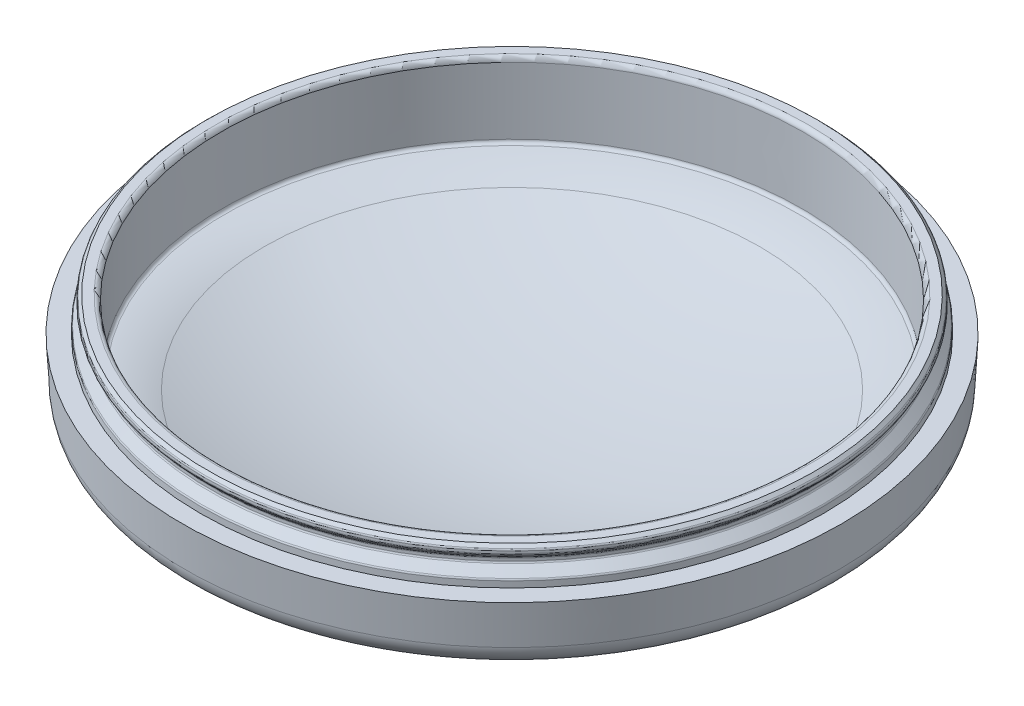
ISO-10303-21;
HEADER;
FILE_DESCRIPTION(('STEP AP214'),'2;1');
FILE_NAME('part.step','',(''),(''),'','','');
FILE_SCHEMA(('AUTOMOTIVE_DESIGN { 1 0 10303 214 1 1 1 1 }'));
ENDSEC;
DATA;
#1=APPLICATION_CONTEXT('core data for automotive mechanical design processes');
#2=APPLICATION_PROTOCOL_DEFINITION('international standard','automotive_design',2000,#1);
#3=PRODUCT_CONTEXT('',#1,'mechanical');
#4=PRODUCT('Part','Part','',(#3));
#5=PRODUCT_RELATED_PRODUCT_CATEGORY('part','',(#4));
#6=PRODUCT_DEFINITION_FORMATION('','',#4);
#7=PRODUCT_DEFINITION_CONTEXT('part definition',#1,'design');
#8=PRODUCT_DEFINITION('design','',#6,#7);
#9=PRODUCT_DEFINITION_SHAPE('','',#8);
#10=(LENGTH_UNIT() NAMED_UNIT(*) SI_UNIT(.MILLI.,.METRE.));
#11=(NAMED_UNIT(*) PLANE_ANGLE_UNIT() SI_UNIT($,.RADIAN.));
#12=(NAMED_UNIT(*) SI_UNIT($,.STERADIAN.) SOLID_ANGLE_UNIT());
#13=UNCERTAINTY_MEASURE_WITH_UNIT(LENGTH_MEASURE(1.E-05),#10,'distance_accuracy_value','');
#14=(GEOMETRIC_REPRESENTATION_CONTEXT(3) GLOBAL_UNCERTAINTY_ASSIGNED_CONTEXT((#13)) GLOBAL_UNIT_ASSIGNED_CONTEXT((#10,
#11,#12)) REPRESENTATION_CONTEXT('',''));
#15=CARTESIAN_POINT('',(0.,0.,0.));
#16=DIRECTION('',(0.,0.,1.));
#17=DIRECTION('',(1.,0.,0.));
#18=AXIS2_PLACEMENT_3D('',#15,#16,#17);
#19=CARTESIAN_POINT('',(0.,0.,0.));
#20=DIRECTION('',(0.,-1.,0.));
#21=DIRECTION('',(1.,0.,0.));
#22=AXIS2_PLACEMENT_3D('',#19,#20,#21);
#23=PLANE('',#22);
#24=CARTESIAN_POINT('',(0.,0.,0.));
#25=DIRECTION('',(0.,-1.,0.));
#26=DIRECTION('',(1.,0.,0.));
#27=AXIS2_PLACEMENT_3D('',#24,#25,#26);
#28=CIRCLE('',#27,13.9150898701436);
#29=CARTESIAN_POINT('',(13.9150898701436,0.,0.));
#30=VERTEX_POINT('',#29);
#31=EDGE_CURVE('E87',#30,#30,#28,.F.);
#32=ORIENTED_EDGE('',*,*,#31,.F.);
#33=EDGE_LOOP('',(#32));
#34=FACE_BOUND('',#33,.T.);
#35=CARTESIAN_POINT('',(0.,0.,0.));
#36=DIRECTION('',(0.,-1.,0.));
#37=DIRECTION('',(1.,0.,0.));
#38=AXIS2_PLACEMENT_3D('',#35,#36,#37);
#39=CIRCLE('',#38,14.71721203);
#40=CARTESIAN_POINT('',(14.71721203,0.,0.));
#41=VERTEX_POINT('',#40);
#42=EDGE_CURVE('E90',#41,#41,#39,.T.);
#43=ORIENTED_EDGE('',*,*,#42,.F.);
#44=EDGE_LOOP('',(#43));
#45=FACE_BOUND('',#44,.T.);
#46=ADVANCED_FACE('F33',(#34,#45),#23,.F.);
#47=CARTESIAN_POINT('',(0.,0.,0.));
#48=DIRECTION('',(0.,1.,0.));
#49=DIRECTION('',(-1.,0.,0.));
#50=AXIS2_PLACEMENT_3D('',#47,#48,#49);
#51=CONICAL_SURFACE('',#50,14.71721203,0.0523598775598355);
#52=CARTESIAN_POINT('',(0.,-1.80397857768988,0.));
#53=DIRECTION('',(0.,-1.,0.));
#54=DIRECTION('',(1.,0.,0.));
#55=AXIS2_PLACEMENT_3D('',#52,#53,#54);
#56=CIRCLE('',#55,14.6226695188691);
#57=CARTESIAN_POINT('',(14.6226695188691,-1.80397857768989,0.));
#58=VERTEX_POINT('',#57);
#59=EDGE_CURVE('E93',#58,#58,#56,.T.);
#60=ORIENTED_EDGE('',*,*,#59,.F.);
#61=EDGE_LOOP('',(#60));
#62=FACE_BOUND('',#61,.T.);
#63=ORIENTED_EDGE('',*,*,#42,.T.);
#64=EDGE_LOOP('',(#63));
#65=FACE_BOUND('',#64,.T.);
#66=ADVANCED_FACE('F123',(#62,#65),#51,.T.);
#67=CARTESIAN_POINT('',(0.,-1.75164262156415,0.));
#68=DIRECTION('',(0.,-1.,0.));
#69=DIRECTION('',(1.,0.,0.));
#70=AXIS2_PLACEMENT_3D('',#67,#68,#69);
#71=TOROIDAL_SURFACE('',#70,13.6240399863513,0.999999997760164);
#72=CARTESIAN_POINT('',(0.,-2.75140795942134,0.));
#73=DIRECTION('',(0.,-1.,0.));
#74=DIRECTION('',(1.,0.,0.));
#75=AXIS2_PLACEMENT_3D('',#72,#73,#74);
#76=CIRCLE('',#75,13.6023774671155);
#77=CARTESIAN_POINT('',(13.6023774671155,-2.75140795942135,0.));
#78=VERTEX_POINT('',#77);
#79=EDGE_CURVE('E96',#78,#78,#76,.T.);
#80=ORIENTED_EDGE('',*,*,#79,.F.);
#81=EDGE_LOOP('',(#80));
#82=FACE_BOUND('',#81,.T.);
#83=ORIENTED_EDGE('',*,*,#59,.T.);
#84=EDGE_LOOP('',(#83));
#85=FACE_BOUND('',#84,.T.);
#86=ADVANCED_FACE('F129',(#82,#85),#71,.T.);
#87=CARTESIAN_POINT('',(0.,-8.75000000000029,0.));
#88=DIRECTION('',(0.,-1.,0.));
#89=DIRECTION('',(1.,0.,0.));
#90=AXIS2_PLACEMENT_3D('',#87,#88,#89);
#91=TOROIDAL_SURFACE('',#90,13.4724023514095,5.99999999999997);
#92=CARTESIAN_POINT('',(0.,-3.11381974614816,0.));
#93=DIRECTION('',(0.,-1.,0.));
#94=DIRECTION('',(1.,0.,0.));
#95=AXIS2_PLACEMENT_3D('',#92,#93,#94);
#96=CIRCLE('',#95,11.414862036838);
#97=CARTESIAN_POINT('',(11.414862036838,-3.11381974614817,0.));
#98=VERTEX_POINT('',#97);
#99=EDGE_CURVE('E99',#98,#98,#96,.T.);
#100=ORIENTED_EDGE('',*,*,#99,.F.);
#101=EDGE_LOOP('',(#100));
#102=FACE_BOUND('',#101,.T.);
#103=ORIENTED_EDGE('',*,*,#79,.T.);
#104=EDGE_LOOP('',(#103));
#105=FACE_BOUND('',#104,.T.);
#106=ADVANCED_FACE('F201',(#102,#105),#91,.F.);
#107=CARTESIAN_POINT('',(0.,28.1546903077457,0.));
#108=DIRECTION('',(0.,-1.,0.));
#109=DIRECTION('',(-1.,0.,0.));
#110=AXIS2_PLACEMENT_3D('',#107,#108,#109);
#111=SPHERICAL_SURFACE('',#110,33.2869162932001);
#112=ORIENTED_EDGE('',*,*,#99,.T.);
#113=EDGE_LOOP('',(#112));
#114=FACE_BOUND('',#113,.T.);
#115=ADVANCED_FACE('F191',(#114),#111,.T.);
#116=CARTESIAN_POINT('',(0.,0.309804838267562,0.));
#117=DIRECTION('',(0.,-1.,0.));
#118=DIRECTION('',(0.,0.,-1.));
#119=AXIS2_PLACEMENT_3D('',#116,#117,#118);
#120=CONICAL_SURFACE('',#119,13.9096822065765,0.0174532925199385);
#121=CARTESIAN_POINT('',(0.,0.268389790703316,0.));
#122=DIRECTION('',(0.,1.,0.));
#123=DIRECTION('',(0.,0.,1.));
#124=AXIS2_PLACEMENT_3D('',#121,#122,#123);
#125=CIRCLE('',#124,13.9104051089208);
#126=CARTESIAN_POINT('',(0.,0.268389790703316,13.9104051089208));
#127=VERTEX_POINT('',#126);
#128=EDGE_CURVE('E11',#127,#127,#125,.F.);
#129=ORIENTED_EDGE('',*,*,#128,.T.);
#130=EDGE_LOOP('',(#129));
#131=FACE_BOUND('',#130,.T.);
#132=ORIENTED_EDGE('',*,*,#31,.T.);
#133=EDGE_LOOP('',(#132));
#134=FACE_BOUND('',#133,.T.);
#135=ADVANCED_FACE('F186',(#131,#134),#120,.T.);
#136=CARTESIAN_POINT('',(-13.,1.5,0.));
#137=DIRECTION('',(0.,-1.,0.));
#138=DIRECTION('',(0.,0.,-1.));
#139=AXIS2_PLACEMENT_3D('',#136,#137,#138);
#140=PLANE('',#139);
#141=CARTESIAN_POINT('',(0.,1.5,0.));
#142=DIRECTION('',(0.,-1.,0.));
#143=DIRECTION('',(0.,0.,-1.));
#144=AXIS2_PLACEMENT_3D('',#141,#142,#143);
#145=CIRCLE('',#144,13.1965394526231);
#146=CARTESIAN_POINT('',(0.,1.5,-13.1965394526231));
#147=VERTEX_POINT('',#146);
#148=EDGE_CURVE('E78',#147,#147,#145,.T.);
#149=ORIENTED_EDGE('',*,*,#148,.T.);
#150=EDGE_LOOP('',(#149));
#151=FACE_BOUND('',#150,.T.);
#152=CARTESIAN_POINT('',(0.,1.5,0.));
#153=DIRECTION('',(0.,-1.,0.));
#154=DIRECTION('',(0.,0.,-1.));
#155=AXIS2_PLACEMENT_3D('',#152,#153,#154);
#156=CIRCLE('',#155,13.5879898280792);
#157=CARTESIAN_POINT('',(0.,1.5,-13.5879898280792));
#158=VERTEX_POINT('',#157);
#159=EDGE_CURVE('E72',#158,#158,#156,.T.);
#160=ORIENTED_EDGE('',*,*,#159,.F.);
#161=EDGE_LOOP('',(#160));
#162=FACE_BOUND('',#161,.T.);
#163=ADVANCED_FACE('F148',(#151,#162),#140,.F.);
#164=CARTESIAN_POINT('',(0.,1.39393398282201,0.));
#165=DIRECTION('',(0.,-1.,0.));
#166=DIRECTION('',(0.,0.,-1.));
#167=AXIS2_PLACEMENT_3D('',#164,#165,#166);
#168=CONICAL_SURFACE('',#167,13.6940558452571,0.785398163397447);
#169=CARTESIAN_POINT('',(0.,1.37499370677793,0.));
#170=DIRECTION('',(0.,1.,0.));
#171=DIRECTION('',(0.,0.,1.));
#172=AXIS2_PLACEMENT_3D('',#169,#170,#171);
#173=CIRCLE('',#172,13.7129961213012);
#174=CARTESIAN_POINT('',(0.,1.37499370677793,13.7129961213012));
#175=VERTEX_POINT('',#174);
#176=EDGE_CURVE('E40',#175,#175,#173,.T.);
#177=ORIENTED_EDGE('',*,*,#176,.T.);
#178=EDGE_LOOP('',(#177));
#179=FACE_BOUND('',#178,.T.);
#180=ORIENTED_EDGE('',*,*,#159,.T.);
#181=EDGE_LOOP('',(#180));
#182=FACE_BOUND('',#181,.T.);
#183=ADVANCED_FACE('F144',(#179,#182),#168,.T.);
#184=CARTESIAN_POINT('',(0.,1.407019441974,0.));
#185=DIRECTION('',(0.,-1.,0.));
#186=DIRECTION('',(0.,0.,-1.));
#187=AXIS2_PLACEMENT_3D('',#184,#185,#186);
#188=CONICAL_SURFACE('',#187,13.7405074052221,0.0174532925199406);
#189=CARTESIAN_POINT('',(0.,1.30602826930304,0.));
#190=DIRECTION('',(0.,1.,0.));
#191=DIRECTION('',(0.,0.,1.));
#192=AXIS2_PLACEMENT_3D('',#189,#190,#191);
#193=CIRCLE('',#192,13.7422702126982);
#194=CARTESIAN_POINT('',(0.,1.30602826930304,13.7422702126982));
#195=VERTEX_POINT('',#194);
#196=EDGE_CURVE('E44',#195,#195,#193,.F.);
#197=ORIENTED_EDGE('',*,*,#196,.T.);
#198=EDGE_LOOP('',(#197));
#199=FACE_BOUND('',#198,.T.);
#200=CARTESIAN_POINT('',(0.,1.19847256574901,0.));
#201=DIRECTION('',(0.,1.,0.));
#202=DIRECTION('',(0.,0.,1.));
#203=AXIS2_PLACEMENT_3D('',#200,#201,#202);
#204=CIRCLE('',#203,13.7441476044872);
#205=CARTESIAN_POINT('',(0.,1.19847256574901,13.7441476044872));
#206=VERTEX_POINT('',#205);
#207=EDGE_CURVE('E48',#206,#206,#204,.T.);
#208=ORIENTED_EDGE('',*,*,#207,.T.);
#209=EDGE_LOOP('',(#208));
#210=FACE_BOUND('',#209,.T.);
#211=ADVANCED_FACE('F147',(#199,#210),#188,.T.);
#212=CARTESIAN_POINT('',(0.,1.30965253342395,0.));
#213=DIRECTION('',(0.,1.,0.));
#214=DIRECTION('',(0.,0.,1.));
#215=AXIS2_PLACEMENT_3D('',#212,#213,#214);
#216=CONICAL_SURFACE('',#215,13.8922298001393,0.767944870877511);
#217=CARTESIAN_POINT('',(0.,0.932528522911992,0.));
#218=DIRECTION('',(0.,1.,0.));
#219=DIRECTION('',(0.,0.,1.));
#220=AXIS2_PLACEMENT_3D('',#217,#218,#219);
#221=CIRCLE('',#220,13.5280453764776);
#222=CARTESIAN_POINT('',(0.,0.932528522911992,13.5280453764776));
#223=VERTEX_POINT('',#222);
#224=EDGE_CURVE('E59',#223,#223,#221,.T.);
#225=ORIENTED_EDGE('',*,*,#224,.T.);
#226=EDGE_LOOP('',(#225));
#227=FACE_BOUND('',#226,.T.);
#228=CARTESIAN_POINT('',(0.,1.1272614880594,0.));
#229=DIRECTION('',(0.,-1.,0.));
#230=DIRECTION('',(0.,0.,-1.));
#231=AXIS2_PLACEMENT_3D('',#228,#229,#230);
#232=CIRCLE('',#231,13.7160968150054);
#233=CARTESIAN_POINT('',(0.,1.1272614880594,-13.7160968150054));
#234=VERTEX_POINT('',#233);
#235=EDGE_CURVE('E62',#234,#234,#232,.T.);
#236=ORIENTED_EDGE('',*,*,#235,.T.);
#237=EDGE_LOOP('',(#236));
#238=FACE_BOUND('',#237,.T.);
#239=ADVANCED_FACE('F151',(#227,#238),#216,.T.);
#240=CARTESIAN_POINT('',(0.,0.902732492786487,0.));
#241=DIRECTION('',(0.,-1.,0.));
#242=DIRECTION('',(0.,0.,-1.));
#243=AXIS2_PLACEMENT_3D('',#240,#241,#242);
#244=CONICAL_SURFACE('',#243,13.4992716846516,0.0174532925199405);
#245=CARTESIAN_POINT('',(0.,0.861317445222362,0.));
#246=DIRECTION('',(0.,-1.,0.));
#247=DIRECTION('',(0.,0.,-1.));
#248=AXIS2_PLACEMENT_3D('',#245,#246,#247);
#249=CIRCLE('',#248,13.4999945869959);
#250=CARTESIAN_POINT('',(0.,0.861317445222362,-13.4999945869959));
#251=VERTEX_POINT('',#250);
#252=EDGE_CURVE('E65',#251,#251,#249,.T.);
#253=ORIENTED_EDGE('',*,*,#252,.T.);
#254=EDGE_LOOP('',(#253));
#255=FACE_BOUND('',#254,.T.);
#256=CARTESIAN_POINT('',(0.,0.744178001319334,0.));
#257=DIRECTION('',(0.,-1.,0.));
#258=DIRECTION('',(0.,0.,-1.));
#259=AXIS2_PLACEMENT_3D('',#256,#257,#258);
#260=CIRCLE('',#259,13.5020392635948);
#261=CARTESIAN_POINT('',(0.,0.744178001319334,-13.5020392635948));
#262=VERTEX_POINT('',#261);
#263=EDGE_CURVE('E68',#262,#262,#260,.F.);
#264=ORIENTED_EDGE('',*,*,#263,.T.);
#265=EDGE_LOOP('',(#264));
#266=FACE_BOUND('',#265,.T.);
#267=ADVANCED_FACE('F175',(#255,#266),#244,.T.);
#268=CARTESIAN_POINT('',(0.,0.702762953755208,0.));
#269=DIRECTION('',(0.,-1.,0.));
#270=DIRECTION('',(0.,0.,-1.));
#271=AXIS2_PLACEMENT_3D('',#268,#269,#270);
#272=CONICAL_SURFACE('',#271,13.5027621659391,0.802851455917387);
#273=CARTESIAN_POINT('',(0.,0.673989261929195,0.));
#274=DIRECTION('',(0.,-1.,0.));
#275=DIRECTION('',(0.,0.,-1.));
#276=AXIS2_PLACEMENT_3D('',#273,#274,#275);
#277=CIRCLE('',#276,13.5325581960646);
#278=CARTESIAN_POINT('',(0.,0.673989261929195,-13.5325581960646));
#279=VERTEX_POINT('',#278);
#280=EDGE_CURVE('E53',#279,#279,#277,.T.);
#281=ORIENTED_EDGE('',*,*,#280,.T.);
#282=EDGE_LOOP('',(#281));
#283=FACE_BOUND('',#282,.T.);
#284=CARTESIAN_POINT('',(0.,0.338578530093574,0.));
#285=DIRECTION('',(0.,1.,0.));
#286=DIRECTION('',(0.,0.,1.));
#287=AXIS2_PLACEMENT_3D('',#284,#285,#286);
#288=CIRCLE('',#287,13.879886176451);
#289=CARTESIAN_POINT('',(0.,0.338578530093574,13.879886176451));
#290=VERTEX_POINT('',#289);
#291=EDGE_CURVE('E56',#290,#290,#288,.T.);
#292=ORIENTED_EDGE('',*,*,#291,.T.);
#293=EDGE_LOOP('',(#292));
#294=FACE_BOUND('',#293,.T.);
#295=ADVANCED_FACE('F118',(#283,#294),#272,.T.);
#296=CARTESIAN_POINT('',(0.,-2.,0.));
#297=DIRECTION('',(0.,1.,0.));
#298=DIRECTION('',(0.,0.,1.));
#299=AXIS2_PLACEMENT_3D('',#296,#297,#298);
#300=CONICAL_SURFACE('',#299,12.9389072727512,0.0174532925199468);
#301=CARTESIAN_POINT('',(0.,1.30349048128742,0.));
#302=DIRECTION('',(0.,-1.,0.));
#303=DIRECTION('',(0.,0.,-1.));
#304=AXIS2_PLACEMENT_3D('',#301,#302,#303);
#305=CIRCLE('',#304,12.9965699135919);
#306=CARTESIAN_POINT('',(0.,1.30349048128742,-12.9965699135919));
#307=VERTEX_POINT('',#306);
#308=EDGE_CURVE('E71',#307,#307,#305,.F.);
#309=ORIENTED_EDGE('',*,*,#308,.T.);
#310=EDGE_LOOP('',(#309));
#311=FACE_BOUND('',#310,.T.);
#312=CARTESIAN_POINT('',(0.,-1.63475020565218,0.));
#313=DIRECTION('',(0.,-1.,0.));
#314=DIRECTION('',(1.,0.,0.));
#315=AXIS2_PLACEMENT_3D('',#312,#313,#314);
#316=CIRCLE('',#315,12.9452827316266);
#317=CARTESIAN_POINT('',(12.9452827316266,-1.63475020565219,0.));
#318=VERTEX_POINT('',#317);
#319=EDGE_CURVE('E81',#318,#318,#316,.T.);
#320=ORIENTED_EDGE('',*,*,#319,.T.);
#321=EDGE_LOOP('',(#320));
#322=FACE_BOUND('',#321,.T.);
#323=ADVANCED_FACE('F109',(#311,#322),#300,.F.);
#324=CARTESIAN_POINT('',(0.,28.1546903077457,0.));
#325=DIRECTION('',(0.,-1.,0.));
#326=DIRECTION('',(-1.,0.,0.));
#327=AXIS2_PLACEMENT_3D('',#324,#325,#326);
#328=SPHERICAL_SURFACE('',#327,32.2869162932001);
#329=CARTESIAN_POINT('',(0.,-2.17445637050612,0.));
#330=DIRECTION('',(0.,-1.,0.));
#331=DIRECTION('',(1.,0.,0.));
#332=AXIS2_PLACEMENT_3D('',#329,#330,#331);
#333=CIRCLE('',#332,11.0719386510761);
#334=CARTESIAN_POINT('',(11.071938651076,-2.17445637050613,0.));
#335=VERTEX_POINT('',#334);
#336=EDGE_CURVE('E75',#335,#335,#333,.T.);
#337=ORIENTED_EDGE('',*,*,#336,.F.);
#338=EDGE_LOOP('',(#337));
#339=FACE_BOUND('',#338,.T.);
#340=ADVANCED_FACE('F107',(#339),#328,.F.);
#341=CARTESIAN_POINT('',(0.,-8.75000000000029,0.));
#342=DIRECTION('',(0.,-1.,0.));
#343=DIRECTION('',(1.,0.,0.));
#344=AXIS2_PLACEMENT_3D('',#341,#342,#343);
#345=TOROIDAL_SURFACE('',#344,13.4724023514095,6.99999999999997);
#346=CARTESIAN_POINT('',(0.,-1.78145823955342,0.));
#347=DIRECTION('',(0.,-1.,0.));
#348=DIRECTION('',(1.,0.,0.));
#349=AXIS2_PLACEMENT_3D('',#346,#347,#348);
#350=CIRCLE('',#349,12.8095104047809);
#351=CARTESIAN_POINT('',(12.8095104047809,-1.78145823955342,0.));
#352=VERTEX_POINT('',#351);
#353=EDGE_CURVE('E84',#352,#352,#350,.F.);
#354=ORIENTED_EDGE('',*,*,#353,.T.);
#355=EDGE_LOOP('',(#354));
#356=FACE_BOUND('',#355,.T.);
#357=ORIENTED_EDGE('',*,*,#336,.T.);
#358=EDGE_LOOP('',(#357));
#359=FACE_BOUND('',#358,.T.);
#360=ADVANCED_FACE('F105',(#356,#359),#345,.T.);
#361=CARTESIAN_POINT('',(0.,-1.63213234468651,0.));
#362=DIRECTION('',(0.,1.,0.));
#363=DIRECTION('',(-1.,0.,0.));
#364=AXIS2_PLACEMENT_3D('',#361,#362,#363);
#365=TOROIDAL_SURFACE('',#364,12.7953055773531,0.15);
#366=ORIENTED_EDGE('',*,*,#319,.F.);
#367=EDGE_LOOP('',(#366));
#368=FACE_BOUND('',#367,.T.);
#369=ORIENTED_EDGE('',*,*,#353,.F.);
#370=EDGE_LOOP('',(#369));
#371=FACE_BOUND('',#370,.T.);
#372=ADVANCED_FACE('F115',(#368,#371),#365,.F.);
#373=CARTESIAN_POINT('',(0.,1.3,0.));
#374=DIRECTION('',(0.,-1.,0.));
#375=DIRECTION('',(0.,0.,-1.));
#376=AXIS2_PLACEMENT_3D('',#373,#374,#375);
#377=TOROIDAL_SURFACE('',#376,13.1965394526231,0.2);
#378=ORIENTED_EDGE('',*,*,#308,.F.);
#379=EDGE_LOOP('',(#378));
#380=FACE_BOUND('',#379,.T.);
#381=ORIENTED_EDGE('',*,*,#148,.F.);
#382=EDGE_LOOP('',(#381));
#383=FACE_BOUND('',#382,.T.);
#384=ADVANCED_FACE('F138',(#380,#383),#377,.T.);
#385=CARTESIAN_POINT('',(0.,0.86306268586609,0.));
#386=DIRECTION('',(0.,-1.,0.));
#387=DIRECTION('',(0.,0.,-1.));
#388=AXIS2_PLACEMENT_3D('',#385,#386,#387);
#389=TOROIDAL_SURFACE('',#388,13.5999793565115,0.1);
#390=ORIENTED_EDGE('',*,*,#224,.F.);
#391=EDGE_LOOP('',(#390));
#392=FACE_BOUND('',#391,.T.);
#393=ORIENTED_EDGE('',*,*,#252,.F.);
#394=EDGE_LOOP('',(#393));
#395=FACE_BOUND('',#394,.T.);
#396=ADVANCED_FACE('F142',(#392,#395),#389,.F.);
#397=CARTESIAN_POINT('',(0.,0.745923241963062,0.));
#398=DIRECTION('',(0.,-1.,0.));
#399=DIRECTION('',(0.,0.,-1.));
#400=AXIS2_PLACEMENT_3D('',#397,#398,#399);
#401=TOROIDAL_SURFACE('',#400,13.6020240331105,0.1);
#402=ORIENTED_EDGE('',*,*,#263,.F.);
#403=EDGE_LOOP('',(#402));
#404=FACE_BOUND('',#403,.T.);
#405=ORIENTED_EDGE('',*,*,#280,.F.);
#406=EDGE_LOOP('',(#405));
#407=FACE_BOUND('',#406,.T.);
#408=ADVANCED_FACE('F155',(#404,#407),#401,.F.);
#409=CARTESIAN_POINT('',(0.,1.30428302865927,0.));
#410=DIRECTION('',(0.,1.,0.));
#411=DIRECTION('',(0.,0.,1.));
#412=AXIS2_PLACEMENT_3D('',#409,#410,#411);
#413=TOROIDAL_SURFACE('',#412,13.6422854431826,0.1);
#414=ORIENTED_EDGE('',*,*,#176,.F.);
#415=EDGE_LOOP('',(#414));
#416=FACE_BOUND('',#415,.T.);
#417=ORIENTED_EDGE('',*,*,#196,.F.);
#418=EDGE_LOOP('',(#417));
#419=FACE_BOUND('',#418,.T.);
#420=ADVANCED_FACE('F159',(#416,#419),#413,.T.);
#421=CARTESIAN_POINT('',(0.,1.1967273251053,0.));
#422=DIRECTION('',(0.,1.,0.));
#423=DIRECTION('',(0.,0.,1.));
#424=AXIS2_PLACEMENT_3D('',#421,#422,#423);
#425=TOROIDAL_SURFACE('',#424,13.6441628349715,0.1);
#426=ORIENTED_EDGE('',*,*,#207,.F.);
#427=EDGE_LOOP('',(#426));
#428=FACE_BOUND('',#427,.T.);
#429=ORIENTED_EDGE('',*,*,#235,.F.);
#430=EDGE_LOOP('',(#429));
#431=FACE_BOUND('',#430,.T.);
#432=ADVANCED_FACE('F162',(#428,#431),#425,.T.);
#433=CARTESIAN_POINT('',(0.,0.266644550059708,0.));
#434=DIRECTION('',(0.,1.,0.));
#435=DIRECTION('',(0.,0.,1.));
#436=AXIS2_PLACEMENT_3D('',#433,#434,#435);
#437=TOROIDAL_SURFACE('',#436,13.8104203394051,0.1);
#438=ORIENTED_EDGE('',*,*,#291,.F.);
#439=EDGE_LOOP('',(#438));
#440=FACE_BOUND('',#439,.T.);
#441=ORIENTED_EDGE('',*,*,#128,.F.);
#442=EDGE_LOOP('',(#441));
#443=FACE_BOUND('',#442,.T.);
#444=ADVANCED_FACE('F35',(#440,#443),#437,.T.);
#445=CLOSED_SHELL('',(#46,#66,#86,#106,#115,#135,#163,#183,#211,#239,#267,#295,#323,#340,#360,
#372,#384,#396,#408,#420,#432,#444));
#446=MANIFOLD_SOLID_BREP('B2',#445);
#447=ADVANCED_BREP_SHAPE_REPRESENTATION('',(#18,#446),#14);
#448=SHAPE_DEFINITION_REPRESENTATION(#9,#447);
ENDSEC;
END-ISO-10303-21;
